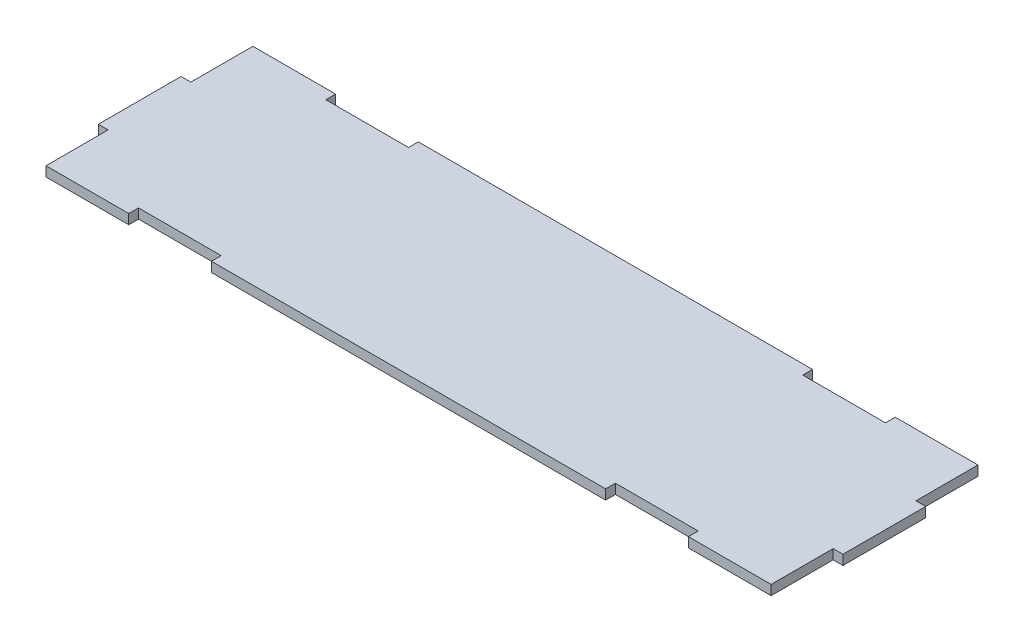
ISO-10303-21;
HEADER;
FILE_DESCRIPTION(('STEP AP214'),'2;1');
FILE_NAME('part.step','',(''),(''),'','','');
FILE_SCHEMA(('AUTOMOTIVE_DESIGN { 1 0 10303 214 1 1 1 1 }'));
ENDSEC;
DATA;
#1=APPLICATION_CONTEXT('core data for automotive mechanical design processes');
#2=APPLICATION_PROTOCOL_DEFINITION('international standard','automotive_design',2000,#1);
#3=PRODUCT_CONTEXT('',#1,'mechanical');
#4=PRODUCT('Part','Part','',(#3));
#5=PRODUCT_RELATED_PRODUCT_CATEGORY('part','',(#4));
#6=PRODUCT_DEFINITION_FORMATION('','',#4);
#7=PRODUCT_DEFINITION_CONTEXT('part definition',#1,'design');
#8=PRODUCT_DEFINITION('design','',#6,#7);
#9=PRODUCT_DEFINITION_SHAPE('','',#8);
#10=(LENGTH_UNIT() NAMED_UNIT(*) SI_UNIT(.MILLI.,.METRE.));
#11=(NAMED_UNIT(*) PLANE_ANGLE_UNIT() SI_UNIT($,.RADIAN.));
#12=(NAMED_UNIT(*) SI_UNIT($,.STERADIAN.) SOLID_ANGLE_UNIT());
#13=UNCERTAINTY_MEASURE_WITH_UNIT(LENGTH_MEASURE(1.E-05),#10,'distance_accuracy_value','');
#14=(GEOMETRIC_REPRESENTATION_CONTEXT(3) GLOBAL_UNCERTAINTY_ASSIGNED_CONTEXT((#13)) GLOBAL_UNIT_ASSIGNED_CONTEXT((#10,
#11,#12)) REPRESENTATION_CONTEXT('',''));
#15=CARTESIAN_POINT('',(0.,0.,0.));
#16=DIRECTION('',(0.,0.,1.));
#17=DIRECTION('',(1.,0.,0.));
#18=AXIS2_PLACEMENT_3D('',#15,#16,#17);
#19=CARTESIAN_POINT('',(-47.4070010471824,2.3622,-79.0049097590282));
#20=DIRECTION('',(1.,0.,0.));
#21=DIRECTION('',(0.,0.,-1.));
#22=AXIS2_PLACEMENT_3D('',#19,#20,#21);
#23=PLANE('',#22);
#24=DIRECTION('',(0.,0.,1.));
#25=VECTOR('',#24,1.);
#26=CARTESIAN_POINT('',(-47.4070010471824,0.,-79.0049097590282));
#27=LINE('',#26,#25);
#28=CARTESIAN_POINT('',(-47.4070010471824,0.,-79.0049097590282));
#29=VERTEX_POINT('',#28);
#30=CARTESIAN_POINT('',(-47.4070010471824,0.,-64.0049097590282));
#31=VERTEX_POINT('',#30);
#32=EDGE_CURVE('E260',#29,#31,#27,.T.);
#33=ORIENTED_EDGE('',*,*,#32,.T.);
#34=DIRECTION('',(0.,-1.,0.));
#35=VECTOR('',#34,1.);
#36=CARTESIAN_POINT('',(-47.4070010471824,2.3622,-64.0049097590282));
#37=LINE('',#36,#35);
#38=CARTESIAN_POINT('',(-47.4070010471824,2.3622,-64.0049097590282));
#39=VERTEX_POINT('',#38);
#40=EDGE_CURVE('E11',#39,#31,#37,.T.);
#41=ORIENTED_EDGE('',*,*,#40,.F.);
#42=DIRECTION('',(0.,0.,1.));
#43=VECTOR('',#42,1.);
#44=CARTESIAN_POINT('',(-47.4070010471824,2.3622,-79.0049097590282));
#45=LINE('',#44,#43);
#46=CARTESIAN_POINT('',(-47.4070010471824,2.3622,-79.0049097590282));
#47=VERTEX_POINT('',#46);
#48=EDGE_CURVE('E342',#47,#39,#45,.T.);
#49=ORIENTED_EDGE('',*,*,#48,.F.);
#50=DIRECTION('',(0.,-1.,0.));
#51=VECTOR('',#50,1.);
#52=CARTESIAN_POINT('',(-47.4070010471824,2.3622,-79.0049097590282));
#53=LINE('',#52,#51);
#54=EDGE_CURVE('E256',#47,#29,#53,.T.);
#55=ORIENTED_EDGE('',*,*,#54,.T.);
#56=EDGE_LOOP('',(#33,#41,#49,#55));
#57=FACE_BOUND('',#56,.T.);
#58=ADVANCED_FACE('F39',(#57),#23,.F.);
#59=CARTESIAN_POINT('',(-47.4070010471824,2.3622,-64.0049097590282));
#60=DIRECTION('',(0.,0.,1.));
#61=DIRECTION('',(1.,0.,0.));
#62=AXIS2_PLACEMENT_3D('',#59,#60,#61);
#63=PLANE('',#62);
#64=DIRECTION('',(-1.,0.,0.));
#65=VECTOR('',#64,1.);
#66=CARTESIAN_POINT('',(-47.4070010471824,0.,-64.0049097590282));
#67=LINE('',#66,#65);
#68=CARTESIAN_POINT('',(-49.7692010471824,0.,-64.0049097590282));
#69=VERTEX_POINT('',#68);
#70=EDGE_CURVE('E264',#31,#69,#67,.T.);
#71=ORIENTED_EDGE('',*,*,#70,.T.);
#72=DIRECTION('',(0.,-1.,0.));
#73=VECTOR('',#72,1.);
#74=CARTESIAN_POINT('',(-49.7692010471824,2.3622,-64.0049097590282));
#75=LINE('',#74,#73);
#76=CARTESIAN_POINT('',(-49.7692010471824,2.3622,-64.0049097590282));
#77=VERTEX_POINT('',#76);
#78=EDGE_CURVE('E48',#77,#69,#75,.T.);
#79=ORIENTED_EDGE('',*,*,#78,.F.);
#80=DIRECTION('',(-1.,0.,0.));
#81=VECTOR('',#80,1.);
#82=CARTESIAN_POINT('',(-47.4070010471824,2.3622,-64.0049097590282));
#83=LINE('',#82,#81);
#84=EDGE_CURVE('E159',#39,#77,#83,.T.);
#85=ORIENTED_EDGE('',*,*,#84,.F.);
#86=ORIENTED_EDGE('',*,*,#40,.T.);
#87=EDGE_LOOP('',(#71,#79,#85,#86));
#88=FACE_BOUND('',#87,.T.);
#89=ADVANCED_FACE('F548',(#88),#63,.F.);
#90=CARTESIAN_POINT('',(-49.7692010471824,2.3622,-64.0049097590282));
#91=DIRECTION('',(1.,0.,0.));
#92=DIRECTION('',(0.,0.,-1.));
#93=AXIS2_PLACEMENT_3D('',#90,#91,#92);
#94=PLANE('',#93);
#95=DIRECTION('',(0.,0.,1.));
#96=VECTOR('',#95,1.);
#97=CARTESIAN_POINT('',(-49.7692010471824,0.,-64.0049097590282));
#98=LINE('',#97,#96);
#99=CARTESIAN_POINT('',(-49.7692010471824,0.,-44.0049097590282));
#100=VERTEX_POINT('',#99);
#101=EDGE_CURVE('E267',#69,#100,#98,.T.);
#102=ORIENTED_EDGE('',*,*,#101,.T.);
#103=DIRECTION('',(0.,-1.,0.));
#104=VECTOR('',#103,1.);
#105=CARTESIAN_POINT('',(-49.7692010471824,2.3622,-44.0049097590282));
#106=LINE('',#105,#104);
#107=CARTESIAN_POINT('',(-49.7692010471824,2.3622,-44.0049097590282));
#108=VERTEX_POINT('',#107);
#109=EDGE_CURVE('E433',#108,#100,#106,.T.);
#110=ORIENTED_EDGE('',*,*,#109,.F.);
#111=DIRECTION('',(0.,0.,1.));
#112=VECTOR('',#111,1.);
#113=CARTESIAN_POINT('',(-49.7692010471824,2.3622,-64.0049097590282));
#114=LINE('',#113,#112);
#115=EDGE_CURVE('E443',#77,#108,#114,.T.);
#116=ORIENTED_EDGE('',*,*,#115,.F.);
#117=ORIENTED_EDGE('',*,*,#78,.T.);
#118=EDGE_LOOP('',(#102,#110,#116,#117));
#119=FACE_BOUND('',#118,.T.);
#120=ADVANCED_FACE('F441',(#119),#94,.F.);
#121=CARTESIAN_POINT('',(-49.7692010471824,2.3622,-44.0049097590282));
#122=DIRECTION('',(0.,0.,-1.));
#123=DIRECTION('',(-1.,0.,0.));
#124=AXIS2_PLACEMENT_3D('',#121,#122,#123);
#125=PLANE('',#124);
#126=DIRECTION('',(1.,0.,0.));
#127=VECTOR('',#126,1.);
#128=CARTESIAN_POINT('',(-49.7692010471824,0.,-44.0049097590282));
#129=LINE('',#128,#127);
#130=CARTESIAN_POINT('',(-47.4070010471824,0.,-44.0049097590282));
#131=VERTEX_POINT('',#130);
#132=EDGE_CURVE('E270',#100,#131,#129,.T.);
#133=ORIENTED_EDGE('',*,*,#132,.T.);
#134=DIRECTION('',(0.,-1.,0.));
#135=VECTOR('',#134,1.);
#136=CARTESIAN_POINT('',(-47.4070010471824,2.3622,-44.0049097590282));
#137=LINE('',#136,#135);
#138=CARTESIAN_POINT('',(-47.4070010471824,2.3622,-44.0049097590282));
#139=VERTEX_POINT('',#138);
#140=EDGE_CURVE('E429',#139,#131,#137,.T.);
#141=ORIENTED_EDGE('',*,*,#140,.F.);
#142=DIRECTION('',(1.,0.,0.));
#143=VECTOR('',#142,1.);
#144=CARTESIAN_POINT('',(-49.7692010471824,2.3622,-44.0049097590282));
#145=LINE('',#144,#143);
#146=EDGE_CURVE('E462',#108,#139,#145,.T.);
#147=ORIENTED_EDGE('',*,*,#146,.F.);
#148=ORIENTED_EDGE('',*,*,#109,.T.);
#149=EDGE_LOOP('',(#133,#141,#147,#148));
#150=FACE_BOUND('',#149,.T.);
#151=ADVANCED_FACE('F452',(#150),#125,.F.);
#152=CARTESIAN_POINT('',(-47.4070010471824,2.3622,-44.0049097590282));
#153=DIRECTION('',(1.,0.,0.));
#154=DIRECTION('',(0.,0.,-1.));
#155=AXIS2_PLACEMENT_3D('',#152,#153,#154);
#156=PLANE('',#155);
#157=DIRECTION('',(0.,0.,1.));
#158=VECTOR('',#157,1.);
#159=CARTESIAN_POINT('',(-47.4070010471824,0.,-44.0049097590282));
#160=LINE('',#159,#158);
#161=CARTESIAN_POINT('',(-47.4070010471824,0.,-29.0049097590282));
#162=VERTEX_POINT('',#161);
#163=EDGE_CURVE('E273',#131,#162,#160,.T.);
#164=ORIENTED_EDGE('',*,*,#163,.T.);
#165=DIRECTION('',(0.,-1.,0.));
#166=VECTOR('',#165,1.);
#167=CARTESIAN_POINT('',(-47.4070010471824,2.3622,-29.0049097590282));
#168=LINE('',#167,#166);
#169=CARTESIAN_POINT('',(-47.4070010471824,2.3622,-29.0049097590282));
#170=VERTEX_POINT('',#169);
#171=EDGE_CURVE('E425',#170,#162,#168,.T.);
#172=ORIENTED_EDGE('',*,*,#171,.F.);
#173=DIRECTION('',(0.,0.,1.));
#174=VECTOR('',#173,1.);
#175=CARTESIAN_POINT('',(-47.4070010471824,2.3622,-44.0049097590282));
#176=LINE('',#175,#174);
#177=EDGE_CURVE('E458',#139,#170,#176,.T.);
#178=ORIENTED_EDGE('',*,*,#177,.F.);
#179=ORIENTED_EDGE('',*,*,#140,.T.);
#180=EDGE_LOOP('',(#164,#172,#178,#179));
#181=FACE_BOUND('',#180,.T.);
#182=ADVANCED_FACE('F456',(#181),#156,.F.);
#183=CARTESIAN_POINT('',(-47.4070010471824,2.3622,-29.0049097590282));
#184=DIRECTION('',(0.,0.,-1.));
#185=DIRECTION('',(-1.,0.,0.));
#186=AXIS2_PLACEMENT_3D('',#183,#184,#185);
#187=PLANE('',#186);
#188=DIRECTION('',(1.,0.,0.));
#189=VECTOR('',#188,1.);
#190=CARTESIAN_POINT('',(-47.4070010471824,0.,-29.0049097590282));
#191=LINE('',#190,#189);
#192=CARTESIAN_POINT('',(-27.4070010471824,0.,-29.0049097590282));
#193=VERTEX_POINT('',#192);
#194=EDGE_CURVE('E276',#162,#193,#191,.T.);
#195=ORIENTED_EDGE('',*,*,#194,.T.);
#196=DIRECTION('',(0.,-1.,0.));
#197=VECTOR('',#196,1.);
#198=CARTESIAN_POINT('',(-27.4070010471824,2.3622,-29.0049097590282));
#199=LINE('',#198,#197);
#200=CARTESIAN_POINT('',(-27.4070010471824,2.3622,-29.0049097590282));
#201=VERTEX_POINT('',#200);
#202=EDGE_CURVE('E421',#201,#193,#199,.T.);
#203=ORIENTED_EDGE('',*,*,#202,.F.);
#204=DIRECTION('',(1.,0.,0.));
#205=VECTOR('',#204,1.);
#206=CARTESIAN_POINT('',(-47.4070010471824,2.3622,-29.0049097590282));
#207=LINE('',#206,#205);
#208=EDGE_CURVE('E461',#170,#201,#207,.T.);
#209=ORIENTED_EDGE('',*,*,#208,.F.);
#210=ORIENTED_EDGE('',*,*,#171,.T.);
#211=EDGE_LOOP('',(#195,#203,#209,#210));
#212=FACE_BOUND('',#211,.T.);
#213=ADVANCED_FACE('F561',(#212),#187,.F.);
#214=CARTESIAN_POINT('',(-27.4070010471824,2.3622,-29.0049097590282));
#215=DIRECTION('',(-1.,0.,0.));
#216=DIRECTION('',(0.,0.,1.));
#217=AXIS2_PLACEMENT_3D('',#214,#215,#216);
#218=PLANE('',#217);
#219=DIRECTION('',(0.,0.,-1.));
#220=VECTOR('',#219,1.);
#221=CARTESIAN_POINT('',(-27.4070010471824,0.,-29.0049097590282));
#222=LINE('',#221,#220);
#223=CARTESIAN_POINT('',(-27.4070010471824,0.,-31.3671097590282));
#224=VERTEX_POINT('',#223);
#225=EDGE_CURVE('E279',#193,#224,#222,.T.);
#226=ORIENTED_EDGE('',*,*,#225,.T.);
#227=DIRECTION('',(0.,-1.,0.));
#228=VECTOR('',#227,1.);
#229=CARTESIAN_POINT('',(-27.4070010471824,2.3622,-31.3671097590282));
#230=LINE('',#229,#228);
#231=CARTESIAN_POINT('',(-27.4070010471824,2.3622,-31.3671097590282));
#232=VERTEX_POINT('',#231);
#233=EDGE_CURVE('E417',#232,#224,#230,.T.);
#234=ORIENTED_EDGE('',*,*,#233,.F.);
#235=DIRECTION('',(0.,0.,-1.));
#236=VECTOR('',#235,1.);
#237=CARTESIAN_POINT('',(-27.4070010471824,2.3622,-29.0049097590282));
#238=LINE('',#237,#236);
#239=EDGE_CURVE('E466',#201,#232,#238,.T.);
#240=ORIENTED_EDGE('',*,*,#239,.F.);
#241=ORIENTED_EDGE('',*,*,#202,.T.);
#242=EDGE_LOOP('',(#226,#234,#240,#241));
#243=FACE_BOUND('',#242,.T.);
#244=ADVANCED_FACE('F564',(#243),#218,.F.);
#245=CARTESIAN_POINT('',(-27.4070010471824,2.3622,-31.3671097590282));
#246=DIRECTION('',(0.,0.,-1.));
#247=DIRECTION('',(-1.,0.,0.));
#248=AXIS2_PLACEMENT_3D('',#245,#246,#247);
#249=PLANE('',#248);
#250=DIRECTION('',(1.,0.,0.));
#251=VECTOR('',#250,1.);
#252=CARTESIAN_POINT('',(-27.4070010471824,0.,-31.3671097590282));
#253=LINE('',#252,#251);
#254=CARTESIAN_POINT('',(-7.40700104718241,0.,-31.3671097590282));
#255=VERTEX_POINT('',#254);
#256=EDGE_CURVE('E282',#224,#255,#253,.T.);
#257=ORIENTED_EDGE('',*,*,#256,.T.);
#258=DIRECTION('',(0.,-1.,0.));
#259=VECTOR('',#258,1.);
#260=CARTESIAN_POINT('',(-7.40700104718241,2.3622,-31.3671097590282));
#261=LINE('',#260,#259);
#262=CARTESIAN_POINT('',(-7.40700104718241,2.3622,-31.3671097590282));
#263=VERTEX_POINT('',#262);
#264=EDGE_CURVE('E413',#263,#255,#261,.T.);
#265=ORIENTED_EDGE('',*,*,#264,.F.);
#266=DIRECTION('',(1.,0.,0.));
#267=VECTOR('',#266,1.);
#268=CARTESIAN_POINT('',(-27.4070010471824,2.3622,-31.3671097590282));
#269=LINE('',#268,#267);
#270=EDGE_CURVE('E473',#232,#263,#269,.T.);
#271=ORIENTED_EDGE('',*,*,#270,.F.);
#272=ORIENTED_EDGE('',*,*,#233,.T.);
#273=EDGE_LOOP('',(#257,#265,#271,#272));
#274=FACE_BOUND('',#273,.T.);
#275=ADVANCED_FACE('F568',(#274),#249,.F.);
#276=CARTESIAN_POINT('',(-7.40700104718241,2.3622,-31.3671097590282));
#277=DIRECTION('',(1.,0.,0.));
#278=DIRECTION('',(0.,0.,-1.));
#279=AXIS2_PLACEMENT_3D('',#276,#277,#278);
#280=PLANE('',#279);
#281=DIRECTION('',(0.,0.,1.));
#282=VECTOR('',#281,1.);
#283=CARTESIAN_POINT('',(-7.40700104718241,0.,-31.3671097590282));
#284=LINE('',#283,#282);
#285=CARTESIAN_POINT('',(-7.40700104718241,0.,-29.0049097590282));
#286=VERTEX_POINT('',#285);
#287=EDGE_CURVE('E285',#255,#286,#284,.T.);
#288=ORIENTED_EDGE('',*,*,#287,.T.);
#289=DIRECTION('',(0.,-1.,0.));
#290=VECTOR('',#289,1.);
#291=CARTESIAN_POINT('',(-7.40700104718241,2.3622,-29.0049097590282));
#292=LINE('',#291,#290);
#293=CARTESIAN_POINT('',(-7.40700104718241,2.3622,-29.0049097590282));
#294=VERTEX_POINT('',#293);
#295=EDGE_CURVE('E409',#294,#286,#292,.T.);
#296=ORIENTED_EDGE('',*,*,#295,.F.);
#297=DIRECTION('',(0.,0.,1.));
#298=VECTOR('',#297,1.);
#299=CARTESIAN_POINT('',(-7.40700104718241,2.3622,-31.3671097590282));
#300=LINE('',#299,#298);
#301=EDGE_CURVE('E476',#263,#294,#300,.T.);
#302=ORIENTED_EDGE('',*,*,#301,.F.);
#303=ORIENTED_EDGE('',*,*,#264,.T.);
#304=EDGE_LOOP('',(#288,#296,#302,#303));
#305=FACE_BOUND('',#304,.T.);
#306=ADVANCED_FACE('F572',(#305),#280,.F.);
#307=CARTESIAN_POINT('',(-7.40700104718241,2.3622,-29.0049097590282));
#308=DIRECTION('',(0.,0.,-1.));
#309=DIRECTION('',(-1.,0.,0.));
#310=AXIS2_PLACEMENT_3D('',#307,#308,#309);
#311=PLANE('',#310);
#312=DIRECTION('',(1.,0.,0.));
#313=VECTOR('',#312,1.);
#314=CARTESIAN_POINT('',(-7.40700104718241,0.,-29.0049097590282));
#315=LINE('',#314,#313);
#316=CARTESIAN_POINT('',(87.8685979272116,0.,-29.0049097590282));
#317=VERTEX_POINT('',#316);
#318=EDGE_CURVE('E288',#286,#317,#315,.T.);
#319=ORIENTED_EDGE('',*,*,#318,.T.);
#320=DIRECTION('',(0.,-1.,0.));
#321=VECTOR('',#320,1.);
#322=CARTESIAN_POINT('',(87.8685979272116,2.3622,-29.0049097590282));
#323=LINE('',#322,#321);
#324=CARTESIAN_POINT('',(87.8685979272116,2.3622,-29.0049097590282));
#325=VERTEX_POINT('',#324);
#326=EDGE_CURVE('E405',#325,#317,#323,.T.);
#327=ORIENTED_EDGE('',*,*,#326,.F.);
#328=DIRECTION('',(1.,0.,0.));
#329=VECTOR('',#328,1.);
#330=CARTESIAN_POINT('',(-7.40700104718241,2.3622,-29.0049097590282));
#331=LINE('',#330,#329);
#332=EDGE_CURVE('E479',#294,#325,#331,.T.);
#333=ORIENTED_EDGE('',*,*,#332,.F.);
#334=ORIENTED_EDGE('',*,*,#295,.T.);
#335=EDGE_LOOP('',(#319,#327,#333,#334));
#336=FACE_BOUND('',#335,.T.);
#337=ADVANCED_FACE('F576',(#336),#311,.F.);
#338=CARTESIAN_POINT('',(87.8685979272116,2.3622,-29.0049097590282));
#339=DIRECTION('',(-1.,0.,0.));
#340=DIRECTION('',(0.,0.,1.));
#341=AXIS2_PLACEMENT_3D('',#338,#339,#340);
#342=PLANE('',#341);
#343=DIRECTION('',(0.,0.,-1.));
#344=VECTOR('',#343,1.);
#345=CARTESIAN_POINT('',(87.8685979272116,0.,-29.0049097590282));
#346=LINE('',#345,#344);
#347=CARTESIAN_POINT('',(87.8685979272116,0.,-31.3671097590282));
#348=VERTEX_POINT('',#347);
#349=EDGE_CURVE('E291',#317,#348,#346,.T.);
#350=ORIENTED_EDGE('',*,*,#349,.T.);
#351=DIRECTION('',(0.,-1.,0.));
#352=VECTOR('',#351,1.);
#353=CARTESIAN_POINT('',(87.8685979272116,2.3622,-31.3671097590282));
#354=LINE('',#353,#352);
#355=CARTESIAN_POINT('',(87.8685979272116,2.3622,-31.3671097590282));
#356=VERTEX_POINT('',#355);
#357=EDGE_CURVE('E401',#356,#348,#354,.T.);
#358=ORIENTED_EDGE('',*,*,#357,.F.);
#359=DIRECTION('',(0.,0.,-1.));
#360=VECTOR('',#359,1.);
#361=CARTESIAN_POINT('',(87.8685979272116,2.3622,-29.0049097590282));
#362=LINE('',#361,#360);
#363=EDGE_CURVE('E482',#325,#356,#362,.T.);
#364=ORIENTED_EDGE('',*,*,#363,.F.);
#365=ORIENTED_EDGE('',*,*,#326,.T.);
#366=EDGE_LOOP('',(#350,#358,#364,#365));
#367=FACE_BOUND('',#366,.T.);
#368=ADVANCED_FACE('F580',(#367),#342,.F.);
#369=CARTESIAN_POINT('',(87.8685979272116,2.3622,-31.3671097590282));
#370=DIRECTION('',(0.,0.,-1.));
#371=DIRECTION('',(-1.,0.,0.));
#372=AXIS2_PLACEMENT_3D('',#369,#370,#371);
#373=PLANE('',#372);
#374=DIRECTION('',(1.,0.,0.));
#375=VECTOR('',#374,1.);
#376=CARTESIAN_POINT('',(87.8685979272116,0.,-31.3671097590282));
#377=LINE('',#376,#375);
#378=CARTESIAN_POINT('',(107.868597927212,0.,-31.3671097590282));
#379=VERTEX_POINT('',#378);
#380=EDGE_CURVE('E294',#348,#379,#377,.T.);
#381=ORIENTED_EDGE('',*,*,#380,.T.);
#382=DIRECTION('',(0.,-1.,0.));
#383=VECTOR('',#382,1.);
#384=CARTESIAN_POINT('',(107.868597927212,2.3622,-31.3671097590282));
#385=LINE('',#384,#383);
#386=CARTESIAN_POINT('',(107.868597927212,2.3622,-31.3671097590282));
#387=VERTEX_POINT('',#386);
#388=EDGE_CURVE('E397',#387,#379,#385,.T.);
#389=ORIENTED_EDGE('',*,*,#388,.F.);
#390=DIRECTION('',(1.,0.,0.));
#391=VECTOR('',#390,1.);
#392=CARTESIAN_POINT('',(87.8685979272116,2.3622,-31.3671097590282));
#393=LINE('',#392,#391);
#394=EDGE_CURVE('E485',#356,#387,#393,.T.);
#395=ORIENTED_EDGE('',*,*,#394,.F.);
#396=ORIENTED_EDGE('',*,*,#357,.T.);
#397=EDGE_LOOP('',(#381,#389,#395,#396));
#398=FACE_BOUND('',#397,.T.);
#399=ADVANCED_FACE('F584',(#398),#373,.F.);
#400=CARTESIAN_POINT('',(107.868597927212,2.3622,-31.3671097590282));
#401=DIRECTION('',(1.,0.,0.));
#402=DIRECTION('',(0.,0.,-1.));
#403=AXIS2_PLACEMENT_3D('',#400,#401,#402);
#404=PLANE('',#403);
#405=DIRECTION('',(0.,0.,1.));
#406=VECTOR('',#405,1.);
#407=CARTESIAN_POINT('',(107.868597927212,0.,-31.3671097590282));
#408=LINE('',#407,#406);
#409=CARTESIAN_POINT('',(107.868597927212,0.,-29.0049097590282));
#410=VERTEX_POINT('',#409);
#411=EDGE_CURVE('E297',#379,#410,#408,.T.);
#412=ORIENTED_EDGE('',*,*,#411,.T.);
#413=DIRECTION('',(0.,-1.,0.));
#414=VECTOR('',#413,1.);
#415=CARTESIAN_POINT('',(107.868597927212,2.3622,-29.0049097590282));
#416=LINE('',#415,#414);
#417=CARTESIAN_POINT('',(107.868597927212,2.3622,-29.0049097590282));
#418=VERTEX_POINT('',#417);
#419=EDGE_CURVE('E393',#418,#410,#416,.T.);
#420=ORIENTED_EDGE('',*,*,#419,.F.);
#421=DIRECTION('',(0.,0.,1.));
#422=VECTOR('',#421,1.);
#423=CARTESIAN_POINT('',(107.868597927212,2.3622,-31.3671097590282));
#424=LINE('',#423,#422);
#425=EDGE_CURVE('E488',#387,#418,#424,.T.);
#426=ORIENTED_EDGE('',*,*,#425,.F.);
#427=ORIENTED_EDGE('',*,*,#388,.T.);
#428=EDGE_LOOP('',(#412,#420,#426,#427));
#429=FACE_BOUND('',#428,.T.);
#430=ADVANCED_FACE('F588',(#429),#404,.F.);
#431=CARTESIAN_POINT('',(107.868597927212,2.3622,-29.0049097590282));
#432=DIRECTION('',(0.,0.,-1.));
#433=DIRECTION('',(-1.,0.,0.));
#434=AXIS2_PLACEMENT_3D('',#431,#432,#433);
#435=PLANE('',#434);
#436=DIRECTION('',(1.,0.,0.));
#437=VECTOR('',#436,1.);
#438=CARTESIAN_POINT('',(107.868597927212,0.,-29.0049097590282));
#439=LINE('',#438,#437);
#440=CARTESIAN_POINT('',(127.868598952818,0.,-29.0049097590282));
#441=VERTEX_POINT('',#440);
#442=EDGE_CURVE('E300',#410,#441,#439,.T.);
#443=ORIENTED_EDGE('',*,*,#442,.T.);
#444=DIRECTION('',(0.,-1.,0.));
#445=VECTOR('',#444,1.);
#446=CARTESIAN_POINT('',(127.868598952818,2.3622,-29.0049097590282));
#447=LINE('',#446,#445);
#448=CARTESIAN_POINT('',(127.868598952818,2.3622,-29.0049097590282));
#449=VERTEX_POINT('',#448);
#450=EDGE_CURVE('E389',#449,#441,#447,.T.);
#451=ORIENTED_EDGE('',*,*,#450,.F.);
#452=DIRECTION('',(1.,0.,0.));
#453=VECTOR('',#452,1.);
#454=CARTESIAN_POINT('',(107.868597927212,2.3622,-29.0049097590282));
#455=LINE('',#454,#453);
#456=EDGE_CURVE('E491',#418,#449,#455,.T.);
#457=ORIENTED_EDGE('',*,*,#456,.F.);
#458=ORIENTED_EDGE('',*,*,#419,.T.);
#459=EDGE_LOOP('',(#443,#451,#457,#458));
#460=FACE_BOUND('',#459,.T.);
#461=ADVANCED_FACE('F592',(#460),#435,.F.);
#462=CARTESIAN_POINT('',(127.868598952818,2.3622,-44.0049097590282));
#463=DIRECTION('',(-1.,0.,0.));
#464=DIRECTION('',(0.,0.,1.));
#465=AXIS2_PLACEMENT_3D('',#462,#463,#464);
#466=PLANE('',#465);
#467=DIRECTION('',(0.,0.,-1.));
#468=VECTOR('',#467,1.);
#469=CARTESIAN_POINT('',(127.868598952818,0.,-44.0049097590282));
#470=LINE('',#469,#468);
#471=CARTESIAN_POINT('',(127.868598952818,0.,-44.0049097590282));
#472=VERTEX_POINT('',#471);
#473=EDGE_CURVE('E303',#441,#472,#470,.T.);
#474=ORIENTED_EDGE('',*,*,#473,.T.);
#475=DIRECTION('',(0.,-1.,0.));
#476=VECTOR('',#475,1.);
#477=CARTESIAN_POINT('',(127.868598952818,2.3622,-44.0049097590282));
#478=LINE('',#477,#476);
#479=CARTESIAN_POINT('',(127.868598952818,2.3622,-44.0049097590282));
#480=VERTEX_POINT('',#479);
#481=EDGE_CURVE('E385',#480,#472,#478,.T.);
#482=ORIENTED_EDGE('',*,*,#481,.F.);
#483=DIRECTION('',(0.,0.,-1.));
#484=VECTOR('',#483,1.);
#485=CARTESIAN_POINT('',(127.868598952818,2.3622,-44.0049097590282));
#486=LINE('',#485,#484);
#487=EDGE_CURVE('E494',#449,#480,#486,.T.);
#488=ORIENTED_EDGE('',*,*,#487,.F.);
#489=ORIENTED_EDGE('',*,*,#450,.T.);
#490=EDGE_LOOP('',(#474,#482,#488,#489));
#491=FACE_BOUND('',#490,.T.);
#492=ADVANCED_FACE('F596',(#491),#466,.F.);
#493=CARTESIAN_POINT('',(130.230798952818,2.3622,-44.0049097590282));
#494=DIRECTION('',(0.,0.,-1.));
#495=DIRECTION('',(-1.,0.,0.));
#496=AXIS2_PLACEMENT_3D('',#493,#494,#495);
#497=PLANE('',#496);
#498=DIRECTION('',(1.,0.,0.));
#499=VECTOR('',#498,1.);
#500=CARTESIAN_POINT('',(130.230798952818,0.,-44.0049097590282));
#501=LINE('',#500,#499);
#502=CARTESIAN_POINT('',(130.230798952818,0.,-44.0049097590282));
#503=VERTEX_POINT('',#502);
#504=EDGE_CURVE('E306',#472,#503,#501,.T.);
#505=ORIENTED_EDGE('',*,*,#504,.T.);
#506=DIRECTION('',(0.,-1.,0.));
#507=VECTOR('',#506,1.);
#508=CARTESIAN_POINT('',(130.230798952818,2.3622,-44.0049097590282));
#509=LINE('',#508,#507);
#510=CARTESIAN_POINT('',(130.230798952818,2.3622,-44.0049097590282));
#511=VERTEX_POINT('',#510);
#512=EDGE_CURVE('E381',#511,#503,#509,.T.);
#513=ORIENTED_EDGE('',*,*,#512,.F.);
#514=DIRECTION('',(1.,0.,0.));
#515=VECTOR('',#514,1.);
#516=CARTESIAN_POINT('',(130.230798952818,2.3622,-44.0049097590282));
#517=LINE('',#516,#515);
#518=EDGE_CURVE('E497',#480,#511,#517,.T.);
#519=ORIENTED_EDGE('',*,*,#518,.F.);
#520=ORIENTED_EDGE('',*,*,#481,.T.);
#521=EDGE_LOOP('',(#505,#513,#519,#520));
#522=FACE_BOUND('',#521,.T.);
#523=ADVANCED_FACE('F600',(#522),#497,.F.);
#524=CARTESIAN_POINT('',(130.230798952818,2.3622,-64.0049097590282));
#525=DIRECTION('',(-1.,0.,0.));
#526=DIRECTION('',(0.,0.,1.));
#527=AXIS2_PLACEMENT_3D('',#524,#525,#526);
#528=PLANE('',#527);
#529=DIRECTION('',(0.,0.,-1.));
#530=VECTOR('',#529,1.);
#531=CARTESIAN_POINT('',(130.230798952818,0.,-64.0049097590282));
#532=LINE('',#531,#530);
#533=CARTESIAN_POINT('',(130.230798952818,0.,-64.0049097590282));
#534=VERTEX_POINT('',#533);
#535=EDGE_CURVE('E309',#503,#534,#532,.T.);
#536=ORIENTED_EDGE('',*,*,#535,.T.);
#537=DIRECTION('',(0.,-1.,0.));
#538=VECTOR('',#537,1.);
#539=CARTESIAN_POINT('',(130.230798952818,2.3622,-64.0049097590282));
#540=LINE('',#539,#538);
#541=CARTESIAN_POINT('',(130.230798952818,2.3622,-64.0049097590282));
#542=VERTEX_POINT('',#541);
#543=EDGE_CURVE('E377',#542,#534,#540,.T.);
#544=ORIENTED_EDGE('',*,*,#543,.F.);
#545=DIRECTION('',(0.,0.,-1.));
#546=VECTOR('',#545,1.);
#547=CARTESIAN_POINT('',(130.230798952818,2.3622,-64.0049097590282));
#548=LINE('',#547,#546);
#549=EDGE_CURVE('E500',#511,#542,#548,.T.);
#550=ORIENTED_EDGE('',*,*,#549,.F.);
#551=ORIENTED_EDGE('',*,*,#512,.T.);
#552=EDGE_LOOP('',(#536,#544,#550,#551));
#553=FACE_BOUND('',#552,.T.);
#554=ADVANCED_FACE('F604',(#553),#528,.F.);
#555=CARTESIAN_POINT('',(127.868597927212,2.3622,-64.0049097590282));
#556=DIRECTION('',(0.,0.,1.));
#557=DIRECTION('',(1.,0.,0.));
#558=AXIS2_PLACEMENT_3D('',#555,#556,#557);
#559=PLANE('',#558);
#560=DIRECTION('',(-1.,0.,0.));
#561=VECTOR('',#560,1.);
#562=CARTESIAN_POINT('',(127.868597927212,0.,-64.0049097590282));
#563=LINE('',#562,#561);
#564=CARTESIAN_POINT('',(127.868597927212,0.,-64.0049097590282));
#565=VERTEX_POINT('',#564);
#566=EDGE_CURVE('E312',#534,#565,#563,.T.);
#567=ORIENTED_EDGE('',*,*,#566,.T.);
#568=DIRECTION('',(0.,-1.,0.));
#569=VECTOR('',#568,1.);
#570=CARTESIAN_POINT('',(127.868597927212,2.3622,-64.0049097590282));
#571=LINE('',#570,#569);
#572=CARTESIAN_POINT('',(127.868597927212,2.3622,-64.0049097590282));
#573=VERTEX_POINT('',#572);
#574=EDGE_CURVE('E373',#573,#565,#571,.T.);
#575=ORIENTED_EDGE('',*,*,#574,.F.);
#576=DIRECTION('',(-1.,0.,0.));
#577=VECTOR('',#576,1.);
#578=CARTESIAN_POINT('',(127.868597927212,2.3622,-64.0049097590282));
#579=LINE('',#578,#577);
#580=EDGE_CURVE('E503',#542,#573,#579,.T.);
#581=ORIENTED_EDGE('',*,*,#580,.F.);
#582=ORIENTED_EDGE('',*,*,#543,.T.);
#583=EDGE_LOOP('',(#567,#575,#581,#582));
#584=FACE_BOUND('',#583,.T.);
#585=ADVANCED_FACE('F608',(#584),#559,.F.);
#586=CARTESIAN_POINT('',(127.868597927212,2.3622,-79.0049097590282));
#587=DIRECTION('',(-1.,0.,0.));
#588=DIRECTION('',(0.,0.,1.));
#589=AXIS2_PLACEMENT_3D('',#586,#587,#588);
#590=PLANE('',#589);
#591=DIRECTION('',(0.,0.,-1.));
#592=VECTOR('',#591,1.);
#593=CARTESIAN_POINT('',(127.868597927212,0.,-79.0049097590282));
#594=LINE('',#593,#592);
#595=CARTESIAN_POINT('',(127.868597927212,0.,-79.0049097590282));
#596=VERTEX_POINT('',#595);
#597=EDGE_CURVE('E315',#565,#596,#594,.T.);
#598=ORIENTED_EDGE('',*,*,#597,.T.);
#599=DIRECTION('',(0.,-1.,0.));
#600=VECTOR('',#599,1.);
#601=CARTESIAN_POINT('',(127.868597927212,2.3622,-79.0049097590282));
#602=LINE('',#601,#600);
#603=CARTESIAN_POINT('',(127.868597927212,2.3622,-79.0049097590282));
#604=VERTEX_POINT('',#603);
#605=EDGE_CURVE('E369',#604,#596,#602,.T.);
#606=ORIENTED_EDGE('',*,*,#605,.F.);
#607=DIRECTION('',(0.,0.,-1.));
#608=VECTOR('',#607,1.);
#609=CARTESIAN_POINT('',(127.868597927212,2.3622,-79.0049097590282));
#610=LINE('',#609,#608);
#611=EDGE_CURVE('E506',#573,#604,#610,.T.);
#612=ORIENTED_EDGE('',*,*,#611,.F.);
#613=ORIENTED_EDGE('',*,*,#574,.T.);
#614=EDGE_LOOP('',(#598,#606,#612,#613));
#615=FACE_BOUND('',#614,.T.);
#616=ADVANCED_FACE('F612',(#615),#590,.F.);
#617=CARTESIAN_POINT('',(107.868597927212,2.3622,-79.0049097590282));
#618=DIRECTION('',(0.,0.,1.));
#619=DIRECTION('',(1.,0.,0.));
#620=AXIS2_PLACEMENT_3D('',#617,#618,#619);
#621=PLANE('',#620);
#622=DIRECTION('',(-1.,0.,0.));
#623=VECTOR('',#622,1.);
#624=CARTESIAN_POINT('',(107.868597927212,0.,-79.0049097590282));
#625=LINE('',#624,#623);
#626=CARTESIAN_POINT('',(107.868597927212,0.,-79.0049097590282));
#627=VERTEX_POINT('',#626);
#628=EDGE_CURVE('E318',#596,#627,#625,.T.);
#629=ORIENTED_EDGE('',*,*,#628,.T.);
#630=DIRECTION('',(0.,-1.,0.));
#631=VECTOR('',#630,1.);
#632=CARTESIAN_POINT('',(107.868597927212,2.3622,-79.0049097590282));
#633=LINE('',#632,#631);
#634=CARTESIAN_POINT('',(107.868597927212,2.3622,-79.0049097590282));
#635=VERTEX_POINT('',#634);
#636=EDGE_CURVE('E365',#635,#627,#633,.T.);
#637=ORIENTED_EDGE('',*,*,#636,.F.);
#638=DIRECTION('',(-1.,0.,0.));
#639=VECTOR('',#638,1.);
#640=CARTESIAN_POINT('',(107.868597927212,2.3622,-79.0049097590282));
#641=LINE('',#640,#639);
#642=EDGE_CURVE('E509',#604,#635,#641,.T.);
#643=ORIENTED_EDGE('',*,*,#642,.F.);
#644=ORIENTED_EDGE('',*,*,#605,.T.);
#645=EDGE_LOOP('',(#629,#637,#643,#644));
#646=FACE_BOUND('',#645,.T.);
#647=ADVANCED_FACE('F616',(#646),#621,.F.);
#648=CARTESIAN_POINT('',(107.868597927212,2.3622,-76.6427097590282));
#649=DIRECTION('',(1.,0.,0.));
#650=DIRECTION('',(0.,0.,-1.));
#651=AXIS2_PLACEMENT_3D('',#648,#649,#650);
#652=PLANE('',#651);
#653=DIRECTION('',(0.,0.,1.));
#654=VECTOR('',#653,1.);
#655=CARTESIAN_POINT('',(107.868597927212,0.,-76.6427097590282));
#656=LINE('',#655,#654);
#657=CARTESIAN_POINT('',(107.868597927212,0.,-76.6427097590282));
#658=VERTEX_POINT('',#657);
#659=EDGE_CURVE('E321',#627,#658,#656,.T.);
#660=ORIENTED_EDGE('',*,*,#659,.T.);
#661=DIRECTION('',(0.,-1.,0.));
#662=VECTOR('',#661,1.);
#663=CARTESIAN_POINT('',(107.868597927212,2.3622,-76.6427097590282));
#664=LINE('',#663,#662);
#665=CARTESIAN_POINT('',(107.868597927212,2.3622,-76.6427097590282));
#666=VERTEX_POINT('',#665);
#667=EDGE_CURVE('E361',#666,#658,#664,.T.);
#668=ORIENTED_EDGE('',*,*,#667,.F.);
#669=DIRECTION('',(0.,0.,1.));
#670=VECTOR('',#669,1.);
#671=CARTESIAN_POINT('',(107.868597927212,2.3622,-76.6427097590282));
#672=LINE('',#671,#670);
#673=EDGE_CURVE('E512',#635,#666,#672,.T.);
#674=ORIENTED_EDGE('',*,*,#673,.F.);
#675=ORIENTED_EDGE('',*,*,#636,.T.);
#676=EDGE_LOOP('',(#660,#668,#674,#675));
#677=FACE_BOUND('',#676,.T.);
#678=ADVANCED_FACE('F620',(#677),#652,.F.);
#679=CARTESIAN_POINT('',(87.8685979272116,2.3622,-76.6427097590282));
#680=DIRECTION('',(0.,0.,1.));
#681=DIRECTION('',(1.,0.,0.));
#682=AXIS2_PLACEMENT_3D('',#679,#680,#681);
#683=PLANE('',#682);
#684=DIRECTION('',(-1.,0.,0.));
#685=VECTOR('',#684,1.);
#686=CARTESIAN_POINT('',(87.8685979272116,0.,-76.6427097590282));
#687=LINE('',#686,#685);
#688=CARTESIAN_POINT('',(87.8685979272116,0.,-76.6427097590282));
#689=VERTEX_POINT('',#688);
#690=EDGE_CURVE('E324',#658,#689,#687,.T.);
#691=ORIENTED_EDGE('',*,*,#690,.T.);
#692=DIRECTION('',(0.,-1.,0.));
#693=VECTOR('',#692,1.);
#694=CARTESIAN_POINT('',(87.8685979272116,2.3622,-76.6427097590282));
#695=LINE('',#694,#693);
#696=CARTESIAN_POINT('',(87.8685979272116,2.3622,-76.6427097590282));
#697=VERTEX_POINT('',#696);
#698=EDGE_CURVE('E357',#697,#689,#695,.T.);
#699=ORIENTED_EDGE('',*,*,#698,.F.);
#700=DIRECTION('',(-1.,0.,0.));
#701=VECTOR('',#700,1.);
#702=CARTESIAN_POINT('',(87.8685979272116,2.3622,-76.6427097590282));
#703=LINE('',#702,#701);
#704=EDGE_CURVE('E515',#666,#697,#703,.T.);
#705=ORIENTED_EDGE('',*,*,#704,.F.);
#706=ORIENTED_EDGE('',*,*,#667,.T.);
#707=EDGE_LOOP('',(#691,#699,#705,#706));
#708=FACE_BOUND('',#707,.T.);
#709=ADVANCED_FACE('F624',(#708),#683,.F.);
#710=CARTESIAN_POINT('',(87.8685979272116,2.3622,-79.0049097590282));
#711=DIRECTION('',(-1.,0.,0.));
#712=DIRECTION('',(0.,0.,1.));
#713=AXIS2_PLACEMENT_3D('',#710,#711,#712);
#714=PLANE('',#713);
#715=DIRECTION('',(0.,0.,-1.));
#716=VECTOR('',#715,1.);
#717=CARTESIAN_POINT('',(87.8685979272116,0.,-79.0049097590282));
#718=LINE('',#717,#716);
#719=CARTESIAN_POINT('',(87.8685979272116,0.,-79.0049097590282));
#720=VERTEX_POINT('',#719);
#721=EDGE_CURVE('E327',#689,#720,#718,.T.);
#722=ORIENTED_EDGE('',*,*,#721,.T.);
#723=DIRECTION('',(0.,-1.,0.));
#724=VECTOR('',#723,1.);
#725=CARTESIAN_POINT('',(87.8685979272116,2.3622,-79.0049097590282));
#726=LINE('',#725,#724);
#727=CARTESIAN_POINT('',(87.8685979272116,2.3622,-79.0049097590282));
#728=VERTEX_POINT('',#727);
#729=EDGE_CURVE('E353',#728,#720,#726,.T.);
#730=ORIENTED_EDGE('',*,*,#729,.F.);
#731=DIRECTION('',(0.,0.,-1.));
#732=VECTOR('',#731,1.);
#733=CARTESIAN_POINT('',(87.8685979272116,2.3622,-79.0049097590282));
#734=LINE('',#733,#732);
#735=EDGE_CURVE('E518',#697,#728,#734,.T.);
#736=ORIENTED_EDGE('',*,*,#735,.F.);
#737=ORIENTED_EDGE('',*,*,#698,.T.);
#738=EDGE_LOOP('',(#722,#730,#736,#737));
#739=FACE_BOUND('',#738,.T.);
#740=ADVANCED_FACE('F628',(#739),#714,.F.);
#741=CARTESIAN_POINT('',(-7.40700104718241,2.3622,-79.0049097590282));
#742=DIRECTION('',(0.,0.,1.));
#743=DIRECTION('',(1.,0.,0.));
#744=AXIS2_PLACEMENT_3D('',#741,#742,#743);
#745=PLANE('',#744);
#746=DIRECTION('',(-1.,0.,0.));
#747=VECTOR('',#746,1.);
#748=CARTESIAN_POINT('',(-7.40700104718241,0.,-79.0049097590282));
#749=LINE('',#748,#747);
#750=CARTESIAN_POINT('',(-7.40700104718241,0.,-79.0049097590282));
#751=VERTEX_POINT('',#750);
#752=EDGE_CURVE('E330',#720,#751,#749,.T.);
#753=ORIENTED_EDGE('',*,*,#752,.T.);
#754=DIRECTION('',(0.,-1.,0.));
#755=VECTOR('',#754,1.);
#756=CARTESIAN_POINT('',(-7.40700104718241,2.3622,-79.0049097590282));
#757=LINE('',#756,#755);
#758=CARTESIAN_POINT('',(-7.40700104718241,2.3622,-79.0049097590282));
#759=VERTEX_POINT('',#758);
#760=EDGE_CURVE('E349',#759,#751,#757,.T.);
#761=ORIENTED_EDGE('',*,*,#760,.F.);
#762=DIRECTION('',(-1.,0.,0.));
#763=VECTOR('',#762,1.);
#764=CARTESIAN_POINT('',(-7.40700104718241,2.3622,-79.0049097590282));
#765=LINE('',#764,#763);
#766=EDGE_CURVE('E521',#728,#759,#765,.T.);
#767=ORIENTED_EDGE('',*,*,#766,.F.);
#768=ORIENTED_EDGE('',*,*,#729,.T.);
#769=EDGE_LOOP('',(#753,#761,#767,#768));
#770=FACE_BOUND('',#769,.T.);
#771=ADVANCED_FACE('F529',(#770),#745,.F.);
#772=CARTESIAN_POINT('',(-7.40700104718241,2.3622,-76.6427097590282));
#773=DIRECTION('',(1.,0.,0.));
#774=DIRECTION('',(0.,0.,-1.));
#775=AXIS2_PLACEMENT_3D('',#772,#773,#774);
#776=PLANE('',#775);
#777=DIRECTION('',(0.,0.,1.));
#778=VECTOR('',#777,1.);
#779=CARTESIAN_POINT('',(-7.40700104718241,0.,-76.6427097590282));
#780=LINE('',#779,#778);
#781=CARTESIAN_POINT('',(-7.40700104718241,0.,-76.6427097590282));
#782=VERTEX_POINT('',#781);
#783=EDGE_CURVE('E333',#751,#782,#780,.T.);
#784=ORIENTED_EDGE('',*,*,#783,.T.);
#785=DIRECTION('',(0.,-1.,0.));
#786=VECTOR('',#785,1.);
#787=CARTESIAN_POINT('',(-7.40700104718241,2.3622,-76.6427097590282));
#788=LINE('',#787,#786);
#789=CARTESIAN_POINT('',(-7.40700104718241,2.3622,-76.6427097590282));
#790=VERTEX_POINT('',#789);
#791=EDGE_CURVE('E249',#790,#782,#788,.T.);
#792=ORIENTED_EDGE('',*,*,#791,.F.);
#793=DIRECTION('',(0.,0.,1.));
#794=VECTOR('',#793,1.);
#795=CARTESIAN_POINT('',(-7.40700104718241,2.3622,-76.6427097590282));
#796=LINE('',#795,#794);
#797=EDGE_CURVE('E238',#759,#790,#796,.T.);
#798=ORIENTED_EDGE('',*,*,#797,.F.);
#799=ORIENTED_EDGE('',*,*,#760,.T.);
#800=EDGE_LOOP('',(#784,#792,#798,#799));
#801=FACE_BOUND('',#800,.T.);
#802=ADVANCED_FACE('F533',(#801),#776,.F.);
#803=CARTESIAN_POINT('',(-27.4070010471824,2.3622,-76.6427097590282));
#804=DIRECTION('',(0.,0.,1.));
#805=DIRECTION('',(1.,0.,0.));
#806=AXIS2_PLACEMENT_3D('',#803,#804,#805);
#807=PLANE('',#806);
#808=DIRECTION('',(-1.,0.,0.));
#809=VECTOR('',#808,1.);
#810=CARTESIAN_POINT('',(-27.4070010471824,0.,-76.6427097590282));
#811=LINE('',#810,#809);
#812=CARTESIAN_POINT('',(-27.4070010471824,0.,-76.6427097590282));
#813=VERTEX_POINT('',#812);
#814=EDGE_CURVE('E247',#782,#813,#811,.T.);
#815=ORIENTED_EDGE('',*,*,#814,.T.);
#816=DIRECTION('',(0.,-1.,0.));
#817=VECTOR('',#816,1.);
#818=CARTESIAN_POINT('',(-27.4070010471824,2.3622,-76.6427097590282));
#819=LINE('',#818,#817);
#820=CARTESIAN_POINT('',(-27.4070010471824,2.3622,-76.6427097590282));
#821=VERTEX_POINT('',#820);
#822=EDGE_CURVE('E244',#821,#813,#819,.T.);
#823=ORIENTED_EDGE('',*,*,#822,.F.);
#824=DIRECTION('',(-1.,0.,0.));
#825=VECTOR('',#824,1.);
#826=CARTESIAN_POINT('',(-27.4070010471824,2.3622,-76.6427097590282));
#827=LINE('',#826,#825);
#828=EDGE_CURVE('E232',#790,#821,#827,.T.);
#829=ORIENTED_EDGE('',*,*,#828,.F.);
#830=ORIENTED_EDGE('',*,*,#791,.T.);
#831=EDGE_LOOP('',(#815,#823,#829,#830));
#832=FACE_BOUND('',#831,.T.);
#833=ADVANCED_FACE('F245',(#832),#807,.F.);
#834=CARTESIAN_POINT('',(-27.4070010471824,2.3622,-79.0049097590282));
#835=DIRECTION('',(-1.,0.,0.));
#836=DIRECTION('',(0.,0.,1.));
#837=AXIS2_PLACEMENT_3D('',#834,#835,#836);
#838=PLANE('',#837);
#839=DIRECTION('',(0.,0.,-1.));
#840=VECTOR('',#839,1.);
#841=CARTESIAN_POINT('',(-27.4070010471824,0.,-79.0049097590282));
#842=LINE('',#841,#840);
#843=CARTESIAN_POINT('',(-27.4070010471824,0.,-79.0049097590282));
#844=VERTEX_POINT('',#843);
#845=EDGE_CURVE('E145',#813,#844,#842,.T.);
#846=ORIENTED_EDGE('',*,*,#845,.T.);
#847=DIRECTION('',(0.,-1.,0.));
#848=VECTOR('',#847,1.);
#849=CARTESIAN_POINT('',(-27.4070010471824,2.3622,-79.0049097590282));
#850=LINE('',#849,#848);
#851=CARTESIAN_POINT('',(-27.4070010471824,2.3622,-79.0049097590282));
#852=VERTEX_POINT('',#851);
#853=EDGE_CURVE('E250',#852,#844,#850,.T.);
#854=ORIENTED_EDGE('',*,*,#853,.F.);
#855=DIRECTION('',(0.,0.,-1.));
#856=VECTOR('',#855,1.);
#857=CARTESIAN_POINT('',(-27.4070010471824,2.3622,-79.0049097590282));
#858=LINE('',#857,#856);
#859=EDGE_CURVE('E236',#821,#852,#858,.T.);
#860=ORIENTED_EDGE('',*,*,#859,.F.);
#861=ORIENTED_EDGE('',*,*,#822,.T.);
#862=EDGE_LOOP('',(#846,#854,#860,#861));
#863=FACE_BOUND('',#862,.T.);
#864=ADVANCED_FACE('F252',(#863),#838,.F.);
#865=CARTESIAN_POINT('',(-47.4070010471824,2.3622,-79.0049097590282));
#866=DIRECTION('',(0.,0.,1.));
#867=DIRECTION('',(1.,0.,0.));
#868=AXIS2_PLACEMENT_3D('',#865,#866,#867);
#869=PLANE('',#868);
#870=DIRECTION('',(-1.,0.,0.));
#871=VECTOR('',#870,1.);
#872=CARTESIAN_POINT('',(-47.4070010471824,0.,-79.0049097590282));
#873=LINE('',#872,#871);
#874=EDGE_CURVE('E151',#844,#29,#873,.T.);
#875=ORIENTED_EDGE('',*,*,#874,.T.);
#876=ORIENTED_EDGE('',*,*,#54,.F.);
#877=DIRECTION('',(-1.,0.,0.));
#878=VECTOR('',#877,1.);
#879=CARTESIAN_POINT('',(-47.4070010471824,2.3622,-79.0049097590282));
#880=LINE('',#879,#878);
#881=EDGE_CURVE('E56',#852,#47,#880,.T.);
#882=ORIENTED_EDGE('',*,*,#881,.F.);
#883=ORIENTED_EDGE('',*,*,#853,.T.);
#884=EDGE_LOOP('',(#875,#876,#882,#883));
#885=FACE_BOUND('',#884,.T.);
#886=ADVANCED_FACE('F537',(#885),#869,.F.);
#887=CARTESIAN_POINT('',(0.,2.3622,0.));
#888=DIRECTION('',(0.,-1.,0.));
#889=DIRECTION('',(0.,0.,-1.));
#890=AXIS2_PLACEMENT_3D('',#887,#888,#889);
#891=PLANE('',#890);
#892=ORIENTED_EDGE('',*,*,#48,.T.);
#893=ORIENTED_EDGE('',*,*,#84,.T.);
#894=ORIENTED_EDGE('',*,*,#115,.T.);
#895=ORIENTED_EDGE('',*,*,#146,.T.);
#896=ORIENTED_EDGE('',*,*,#177,.T.);
#897=ORIENTED_EDGE('',*,*,#208,.T.);
#898=ORIENTED_EDGE('',*,*,#239,.T.);
#899=ORIENTED_EDGE('',*,*,#270,.T.);
#900=ORIENTED_EDGE('',*,*,#301,.T.);
#901=ORIENTED_EDGE('',*,*,#332,.T.);
#902=ORIENTED_EDGE('',*,*,#363,.T.);
#903=ORIENTED_EDGE('',*,*,#394,.T.);
#904=ORIENTED_EDGE('',*,*,#425,.T.);
#905=ORIENTED_EDGE('',*,*,#456,.T.);
#906=ORIENTED_EDGE('',*,*,#487,.T.);
#907=ORIENTED_EDGE('',*,*,#518,.T.);
#908=ORIENTED_EDGE('',*,*,#549,.T.);
#909=ORIENTED_EDGE('',*,*,#580,.T.);
#910=ORIENTED_EDGE('',*,*,#611,.T.);
#911=ORIENTED_EDGE('',*,*,#642,.T.);
#912=ORIENTED_EDGE('',*,*,#673,.T.);
#913=ORIENTED_EDGE('',*,*,#704,.T.);
#914=ORIENTED_EDGE('',*,*,#735,.T.);
#915=ORIENTED_EDGE('',*,*,#766,.T.);
#916=ORIENTED_EDGE('',*,*,#797,.T.);
#917=ORIENTED_EDGE('',*,*,#828,.T.);
#918=ORIENTED_EDGE('',*,*,#859,.T.);
#919=ORIENTED_EDGE('',*,*,#881,.T.);
#920=EDGE_LOOP('',(#892,#893,#894,#895,#896,#897,#898,#899,#900,#901,#902,#903,#904,#905,#906,
#907,#908,#909,#910,#911,#912,#913,#914,#915,#916,#917,#918,#919));
#921=FACE_BOUND('',#920,.T.);
#922=ADVANCED_FACE('F234',(#921),#891,.F.);
#923=CARTESIAN_POINT('',(0.,0.,0.));
#924=DIRECTION('',(0.,-1.,0.));
#925=DIRECTION('',(0.,0.,-1.));
#926=AXIS2_PLACEMENT_3D('',#923,#924,#925);
#927=PLANE('',#926);
#928=ORIENTED_EDGE('',*,*,#32,.F.);
#929=ORIENTED_EDGE('',*,*,#874,.F.);
#930=ORIENTED_EDGE('',*,*,#845,.F.);
#931=ORIENTED_EDGE('',*,*,#814,.F.);
#932=ORIENTED_EDGE('',*,*,#783,.F.);
#933=ORIENTED_EDGE('',*,*,#752,.F.);
#934=ORIENTED_EDGE('',*,*,#721,.F.);
#935=ORIENTED_EDGE('',*,*,#690,.F.);
#936=ORIENTED_EDGE('',*,*,#659,.F.);
#937=ORIENTED_EDGE('',*,*,#628,.F.);
#938=ORIENTED_EDGE('',*,*,#597,.F.);
#939=ORIENTED_EDGE('',*,*,#566,.F.);
#940=ORIENTED_EDGE('',*,*,#535,.F.);
#941=ORIENTED_EDGE('',*,*,#504,.F.);
#942=ORIENTED_EDGE('',*,*,#473,.F.);
#943=ORIENTED_EDGE('',*,*,#442,.F.);
#944=ORIENTED_EDGE('',*,*,#411,.F.);
#945=ORIENTED_EDGE('',*,*,#380,.F.);
#946=ORIENTED_EDGE('',*,*,#349,.F.);
#947=ORIENTED_EDGE('',*,*,#318,.F.);
#948=ORIENTED_EDGE('',*,*,#287,.F.);
#949=ORIENTED_EDGE('',*,*,#256,.F.);
#950=ORIENTED_EDGE('',*,*,#225,.F.);
#951=ORIENTED_EDGE('',*,*,#194,.F.);
#952=ORIENTED_EDGE('',*,*,#163,.F.);
#953=ORIENTED_EDGE('',*,*,#132,.F.);
#954=ORIENTED_EDGE('',*,*,#101,.F.);
#955=ORIENTED_EDGE('',*,*,#70,.F.);
#956=EDGE_LOOP('',(#928,#929,#930,#931,#932,#933,#934,#935,#936,#937,#938,#939,#940,#941,#942,
#943,#944,#945,#946,#947,#948,#949,#950,#951,#952,#953,#954,#955));
#957=FACE_BOUND('',#956,.T.);
#958=ADVANCED_FACE('F447',(#957),#927,.T.);
#959=CLOSED_SHELL('',(#58,#89,#120,#151,#182,#213,#244,#275,#306,#337,#368,#399,#430,#461,#492,
#523,#554,#585,#616,#647,#678,#709,#740,#771,#802,#833,#864,#886,#922,#958));
#960=MANIFOLD_SOLID_BREP('B2',#959);
#961=ADVANCED_BREP_SHAPE_REPRESENTATION('',(#18,#960),#14);
#962=SHAPE_DEFINITION_REPRESENTATION(#9,#961);
ENDSEC;
END-ISO-10303-21;
